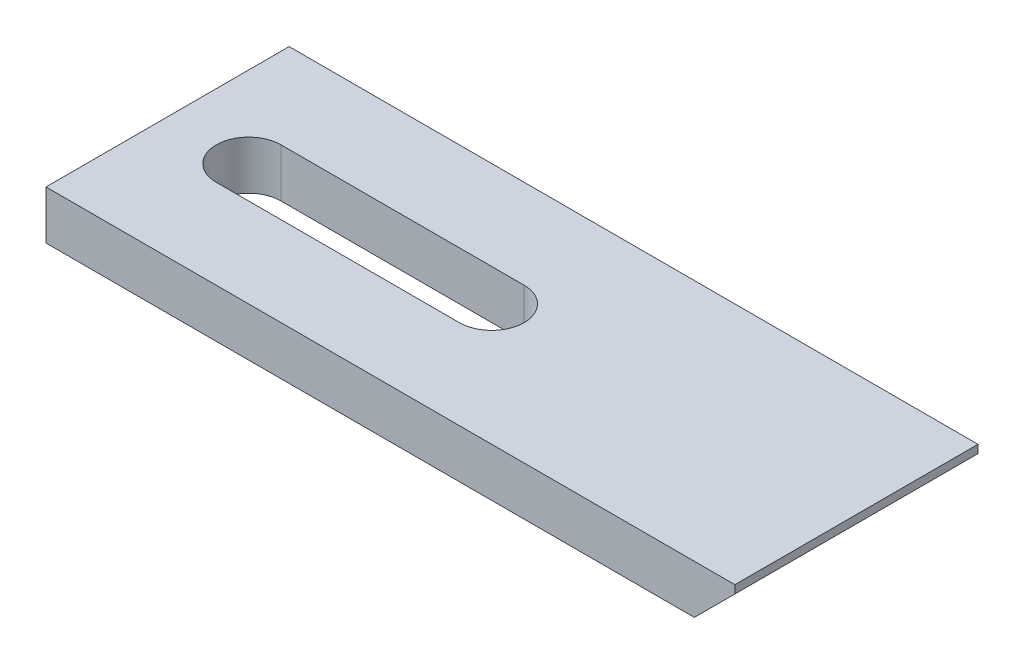
ISO-10303-21;
HEADER;
FILE_DESCRIPTION(('STEP AP214'),'2;1');
FILE_NAME('part.step','',(''),(''),'','','');
FILE_SCHEMA(('AUTOMOTIVE_DESIGN { 1 0 10303 214 1 1 1 1 }'));
ENDSEC;
DATA;
#1=APPLICATION_CONTEXT('core data for automotive mechanical design processes');
#2=APPLICATION_PROTOCOL_DEFINITION('international standard','automotive_design',2000,#1);
#3=PRODUCT_CONTEXT('',#1,'mechanical');
#4=PRODUCT('Part','Part','',(#3));
#5=PRODUCT_RELATED_PRODUCT_CATEGORY('part','',(#4));
#6=PRODUCT_DEFINITION_FORMATION('','',#4);
#7=PRODUCT_DEFINITION_CONTEXT('part definition',#1,'design');
#8=PRODUCT_DEFINITION('design','',#6,#7);
#9=PRODUCT_DEFINITION_SHAPE('','',#8);
#10=(LENGTH_UNIT() NAMED_UNIT(*) SI_UNIT(.MILLI.,.METRE.));
#11=(NAMED_UNIT(*) PLANE_ANGLE_UNIT() SI_UNIT($,.RADIAN.));
#12=(NAMED_UNIT(*) SI_UNIT($,.STERADIAN.) SOLID_ANGLE_UNIT());
#13=UNCERTAINTY_MEASURE_WITH_UNIT(LENGTH_MEASURE(1.E-05),#10,'distance_accuracy_value','');
#14=(GEOMETRIC_REPRESENTATION_CONTEXT(3) GLOBAL_UNCERTAINTY_ASSIGNED_CONTEXT((#13)) GLOBAL_UNIT_ASSIGNED_CONTEXT((#10,
#11,#12)) REPRESENTATION_CONTEXT('',''));
#15=CARTESIAN_POINT('',(0.,0.,0.));
#16=DIRECTION('',(0.,0.,1.));
#17=DIRECTION('',(1.,0.,0.));
#18=AXIS2_PLACEMENT_3D('',#15,#16,#17);
#19=CARTESIAN_POINT('',(-42.5,6.,15.));
#20=DIRECTION('',(0.,1.,0.));
#21=DIRECTION('',(0.,0.,1.));
#22=AXIS2_PLACEMENT_3D('',#19,#20,#21);
#23=PLANE('',#22);
#24=DIRECTION('',(-1.,0.,0.));
#25=VECTOR('',#24,1.);
#26=CARTESIAN_POINT('',(-32.5,6.,-3.99999999999999));
#27=LINE('',#26,#25);
#28=CARTESIAN_POINT('',(-2.5,6.,-3.99999999999999));
#29=VERTEX_POINT('',#28);
#30=CARTESIAN_POINT('',(-32.5,6.,-3.99999999999999));
#31=VERTEX_POINT('',#30);
#32=EDGE_CURVE('E151',#29,#31,#27,.T.);
#33=ORIENTED_EDGE('',*,*,#32,.F.);
#34=CARTESIAN_POINT('',(-2.5,6.,0.));
#35=DIRECTION('',(0.,1.,0.));
#36=DIRECTION('',(0.,0.,-1.));
#37=AXIS2_PLACEMENT_3D('',#34,#35,#36);
#38=CIRCLE('',#37,4.);
#39=CARTESIAN_POINT('',(-2.5,6.,4.00000000000001));
#40=VERTEX_POINT('',#39);
#41=EDGE_CURVE('E169',#40,#29,#38,.T.);
#42=ORIENTED_EDGE('',*,*,#41,.F.);
#43=DIRECTION('',(1.,0.,0.));
#44=VECTOR('',#43,1.);
#45=CARTESIAN_POINT('',(-32.5,6.,4.00000000000001));
#46=LINE('',#45,#44);
#47=CARTESIAN_POINT('',(-32.5,6.,4.00000000000001));
#48=VERTEX_POINT('',#47);
#49=EDGE_CURVE('E161',#48,#40,#46,.T.);
#50=ORIENTED_EDGE('',*,*,#49,.F.);
#51=CARTESIAN_POINT('',(-32.5,6.,0.));
#52=DIRECTION('',(0.,1.,0.));
#53=DIRECTION('',(0.,0.,1.));
#54=AXIS2_PLACEMENT_3D('',#51,#52,#53);
#55=CIRCLE('',#54,4.);
#56=EDGE_CURVE('E155',#31,#48,#55,.T.);
#57=ORIENTED_EDGE('',*,*,#56,.F.);
#58=EDGE_LOOP('',(#33,#42,#50,#57));
#59=FACE_BOUND('',#58,.T.);
#60=DIRECTION('',(0.,0.,1.));
#61=VECTOR('',#60,1.);
#62=CARTESIAN_POINT('',(-42.5,6.,-15.));
#63=LINE('',#62,#61);
#64=CARTESIAN_POINT('',(-42.5,6.,-15.));
#65=VERTEX_POINT('',#64);
#66=CARTESIAN_POINT('',(-42.5,6.,15.));
#67=VERTEX_POINT('',#66);
#68=EDGE_CURVE('E131',#65,#67,#63,.T.);
#69=ORIENTED_EDGE('',*,*,#68,.T.);
#70=DIRECTION('',(1.,0.,0.));
#71=VECTOR('',#70,1.);
#72=CARTESIAN_POINT('',(-42.5,6.,15.));
#73=LINE('',#72,#71);
#74=CARTESIAN_POINT('',(42.5,6.,15.));
#75=VERTEX_POINT('',#74);
#76=EDGE_CURVE('E142',#67,#75,#73,.T.);
#77=ORIENTED_EDGE('',*,*,#76,.T.);
#78=DIRECTION('',(0.,0.,-1.));
#79=VECTOR('',#78,1.);
#80=CARTESIAN_POINT('',(42.5,6.,-15.));
#81=LINE('',#80,#79);
#82=CARTESIAN_POINT('',(42.5,6.,-15.));
#83=VERTEX_POINT('',#82);
#84=EDGE_CURVE('E140',#75,#83,#81,.T.);
#85=ORIENTED_EDGE('',*,*,#84,.T.);
#86=DIRECTION('',(-1.,0.,0.));
#87=VECTOR('',#86,1.);
#88=CARTESIAN_POINT('',(-42.5,6.,-15.));
#89=LINE('',#88,#87);
#90=EDGE_CURVE('E123',#83,#65,#89,.T.);
#91=ORIENTED_EDGE('',*,*,#90,.T.);
#92=EDGE_LOOP('',(#69,#77,#85,#91));
#93=FACE_BOUND('',#92,.T.);
#94=ADVANCED_FACE('F33',(#59,#93),#23,.T.);
#95=CARTESIAN_POINT('',(-42.5,0.,15.));
#96=DIRECTION('',(0.,1.,0.));
#97=DIRECTION('',(0.,0.,1.));
#98=AXIS2_PLACEMENT_3D('',#95,#96,#97);
#99=PLANE('',#98);
#100=CARTESIAN_POINT('',(-2.5,0.,0.));
#101=DIRECTION('',(0.,1.,0.));
#102=DIRECTION('',(0.,0.,-1.));
#103=AXIS2_PLACEMENT_3D('',#100,#101,#102);
#104=CIRCLE('',#103,4.);
#105=CARTESIAN_POINT('',(-2.5,0.,4.00000000000001));
#106=VERTEX_POINT('',#105);
#107=CARTESIAN_POINT('',(-2.5,0.,-3.99999999999999));
#108=VERTEX_POINT('',#107);
#109=EDGE_CURVE('E170',#106,#108,#104,.T.);
#110=ORIENTED_EDGE('',*,*,#109,.T.);
#111=DIRECTION('',(-1.,0.,0.));
#112=VECTOR('',#111,1.);
#113=CARTESIAN_POINT('',(-32.5,0.,-3.99999999999999));
#114=LINE('',#113,#112);
#115=CARTESIAN_POINT('',(-32.5,0.,-3.99999999999999));
#116=VERTEX_POINT('',#115);
#117=EDGE_CURVE('E152',#108,#116,#114,.T.);
#118=ORIENTED_EDGE('',*,*,#117,.T.);
#119=CARTESIAN_POINT('',(-32.5,0.,0.));
#120=DIRECTION('',(0.,1.,0.));
#121=DIRECTION('',(0.,0.,1.));
#122=AXIS2_PLACEMENT_3D('',#119,#120,#121);
#123=CIRCLE('',#122,4.);
#124=CARTESIAN_POINT('',(-32.5,0.,4.00000000000001));
#125=VERTEX_POINT('',#124);
#126=EDGE_CURVE('E157',#116,#125,#123,.T.);
#127=ORIENTED_EDGE('',*,*,#126,.T.);
#128=DIRECTION('',(1.,0.,0.));
#129=VECTOR('',#128,1.);
#130=CARTESIAN_POINT('',(-32.5,0.,4.00000000000001));
#131=LINE('',#130,#129);
#132=EDGE_CURVE('E56',#125,#106,#131,.T.);
#133=ORIENTED_EDGE('',*,*,#132,.T.);
#134=EDGE_LOOP('',(#110,#118,#127,#133));
#135=FACE_BOUND('',#134,.T.);
#136=DIRECTION('',(-1.,0.,0.));
#137=VECTOR('',#136,1.);
#138=CARTESIAN_POINT('',(-42.5,0.,-15.));
#139=LINE('',#138,#137);
#140=CARTESIAN_POINT('',(37.5,0.,-15.));
#141=VERTEX_POINT('',#140);
#142=CARTESIAN_POINT('',(-42.5,0.,-15.));
#143=VERTEX_POINT('',#142);
#144=EDGE_CURVE('E129',#141,#143,#139,.T.);
#145=ORIENTED_EDGE('',*,*,#144,.F.);
#146=DIRECTION('',(0.,0.,1.));
#147=VECTOR('',#146,1.);
#148=CARTESIAN_POINT('',(37.5,0.,-15.));
#149=LINE('',#148,#147);
#150=CARTESIAN_POINT('',(37.5,0.,15.));
#151=VERTEX_POINT('',#150);
#152=EDGE_CURVE('E48',#141,#151,#149,.T.);
#153=ORIENTED_EDGE('',*,*,#152,.T.);
#154=DIRECTION('',(1.,0.,0.));
#155=VECTOR('',#154,1.);
#156=CARTESIAN_POINT('',(-42.5,0.,15.));
#157=LINE('',#156,#155);
#158=CARTESIAN_POINT('',(-42.5,0.,15.));
#159=VERTEX_POINT('',#158);
#160=EDGE_CURVE('E132',#159,#151,#157,.T.);
#161=ORIENTED_EDGE('',*,*,#160,.F.);
#162=DIRECTION('',(0.,0.,1.));
#163=VECTOR('',#162,1.);
#164=CARTESIAN_POINT('',(-42.5,0.,-15.));
#165=LINE('',#164,#163);
#166=EDGE_CURVE('E135',#143,#159,#165,.T.);
#167=ORIENTED_EDGE('',*,*,#166,.F.);
#168=EDGE_LOOP('',(#145,#153,#161,#167));
#169=FACE_BOUND('',#168,.T.);
#170=ADVANCED_FACE('F177',(#135,#169),#99,.F.);
#171=CARTESIAN_POINT('',(-42.5,6.,-15.));
#172=DIRECTION('',(1.,0.,0.));
#173=DIRECTION('',(0.,0.,-1.));
#174=AXIS2_PLACEMENT_3D('',#171,#172,#173);
#175=PLANE('',#174);
#176=ORIENTED_EDGE('',*,*,#166,.T.);
#177=DIRECTION('',(0.,-1.,0.));
#178=VECTOR('',#177,1.);
#179=CARTESIAN_POINT('',(-42.5,6.,15.));
#180=LINE('',#179,#178);
#181=EDGE_CURVE('E11',#67,#159,#180,.T.);
#182=ORIENTED_EDGE('',*,*,#181,.F.);
#183=ORIENTED_EDGE('',*,*,#68,.F.);
#184=DIRECTION('',(0.,-1.,0.));
#185=VECTOR('',#184,1.);
#186=CARTESIAN_POINT('',(-42.5,6.,-15.));
#187=LINE('',#186,#185);
#188=EDGE_CURVE('E124',#65,#143,#187,.T.);
#189=ORIENTED_EDGE('',*,*,#188,.T.);
#190=EDGE_LOOP('',(#176,#182,#183,#189));
#191=FACE_BOUND('',#190,.T.);
#192=ADVANCED_FACE('F35',(#191),#175,.F.);
#193=CARTESIAN_POINT('',(-42.5,6.,15.));
#194=DIRECTION('',(0.,0.,-1.));
#195=DIRECTION('',(-1.,0.,0.));
#196=AXIS2_PLACEMENT_3D('',#193,#194,#195);
#197=PLANE('',#196);
#198=ORIENTED_EDGE('',*,*,#160,.T.);
#199=DIRECTION('',(-0.707106781186547,-0.707106781186548,0.));
#200=VECTOR('',#199,1.);
#201=CARTESIAN_POINT('',(42.5,5.,15.));
#202=LINE('',#201,#200);
#203=CARTESIAN_POINT('',(42.5,5.,15.));
#204=VERTEX_POINT('',#203);
#205=EDGE_CURVE('E110',#204,#151,#202,.T.);
#206=ORIENTED_EDGE('',*,*,#205,.F.);
#207=DIRECTION('',(0.,-1.,0.));
#208=VECTOR('',#207,1.);
#209=CARTESIAN_POINT('',(42.5,6.,15.));
#210=LINE('',#209,#208);
#211=EDGE_CURVE('E41',#75,#204,#210,.T.);
#212=ORIENTED_EDGE('',*,*,#211,.F.);
#213=ORIENTED_EDGE('',*,*,#76,.F.);
#214=ORIENTED_EDGE('',*,*,#181,.T.);
#215=EDGE_LOOP('',(#198,#206,#212,#213,#214));
#216=FACE_BOUND('',#215,.T.);
#217=ADVANCED_FACE('F179',(#216),#197,.F.);
#218=CARTESIAN_POINT('',(42.5,6.,-15.));
#219=DIRECTION('',(-1.,0.,0.));
#220=DIRECTION('',(0.,0.,1.));
#221=AXIS2_PLACEMENT_3D('',#218,#219,#220);
#222=PLANE('',#221);
#223=ORIENTED_EDGE('',*,*,#211,.T.);
#224=DIRECTION('',(0.,0.,1.));
#225=VECTOR('',#224,1.);
#226=CARTESIAN_POINT('',(42.5,5.,-15.));
#227=LINE('',#226,#225);
#228=CARTESIAN_POINT('',(42.5,5.,-15.));
#229=VERTEX_POINT('',#228);
#230=EDGE_CURVE('E105',#229,#204,#227,.T.);
#231=ORIENTED_EDGE('',*,*,#230,.F.);
#232=DIRECTION('',(0.,-1.,0.));
#233=VECTOR('',#232,1.);
#234=CARTESIAN_POINT('',(42.5,6.,-15.));
#235=LINE('',#234,#233);
#236=EDGE_CURVE('E117',#83,#229,#235,.T.);
#237=ORIENTED_EDGE('',*,*,#236,.F.);
#238=ORIENTED_EDGE('',*,*,#84,.F.);
#239=EDGE_LOOP('',(#223,#231,#237,#238));
#240=FACE_BOUND('',#239,.T.);
#241=ADVANCED_FACE('F115',(#240),#222,.F.);
#242=CARTESIAN_POINT('',(-42.5,6.,-15.));
#243=DIRECTION('',(0.,0.,1.));
#244=DIRECTION('',(1.,0.,0.));
#245=AXIS2_PLACEMENT_3D('',#242,#243,#244);
#246=PLANE('',#245);
#247=ORIENTED_EDGE('',*,*,#236,.T.);
#248=DIRECTION('',(-0.707106781186547,-0.707106781186548,0.));
#249=VECTOR('',#248,1.);
#250=CARTESIAN_POINT('',(42.5,5.,-15.));
#251=LINE('',#250,#249);
#252=EDGE_CURVE('E102',#229,#141,#251,.T.);
#253=ORIENTED_EDGE('',*,*,#252,.T.);
#254=ORIENTED_EDGE('',*,*,#144,.T.);
#255=ORIENTED_EDGE('',*,*,#188,.F.);
#256=ORIENTED_EDGE('',*,*,#90,.F.);
#257=EDGE_LOOP('',(#247,#253,#254,#255,#256));
#258=FACE_BOUND('',#257,.T.);
#259=ADVANCED_FACE('F121',(#258),#246,.F.);
#260=CARTESIAN_POINT('',(-32.5,6.,0.));
#261=DIRECTION('',(0.,-1.,0.));
#262=DIRECTION('',(0.,0.,-1.));
#263=AXIS2_PLACEMENT_3D('',#260,#261,#262);
#264=CYLINDRICAL_SURFACE('',#263,4.);
#265=ORIENTED_EDGE('',*,*,#126,.F.);
#266=DIRECTION('',(0.,-1.,0.));
#267=VECTOR('',#266,1.);
#268=CARTESIAN_POINT('',(-32.5,6.,-3.99999999999999));
#269=LINE('',#268,#267);
#270=EDGE_CURVE('E148',#31,#116,#269,.T.);
#271=ORIENTED_EDGE('',*,*,#270,.F.);
#272=ORIENTED_EDGE('',*,*,#56,.T.);
#273=DIRECTION('',(0.,-1.,0.));
#274=VECTOR('',#273,1.);
#275=CARTESIAN_POINT('',(-32.5,6.,4.00000000000001));
#276=LINE('',#275,#274);
#277=EDGE_CURVE('E138',#48,#125,#276,.T.);
#278=ORIENTED_EDGE('',*,*,#277,.T.);
#279=EDGE_LOOP('',(#265,#271,#272,#278));
#280=FACE_BOUND('',#279,.T.);
#281=ADVANCED_FACE('F192',(#280),#264,.F.);
#282=CARTESIAN_POINT('',(-32.5,6.,4.00000000000001));
#283=DIRECTION('',(0.,0.,-1.));
#284=DIRECTION('',(-1.,0.,0.));
#285=AXIS2_PLACEMENT_3D('',#282,#283,#284);
#286=PLANE('',#285);
#287=ORIENTED_EDGE('',*,*,#132,.F.);
#288=ORIENTED_EDGE('',*,*,#277,.F.);
#289=ORIENTED_EDGE('',*,*,#49,.T.);
#290=DIRECTION('',(0.,-1.,0.));
#291=VECTOR('',#290,1.);
#292=CARTESIAN_POINT('',(-2.5,6.,4.00000000000001));
#293=LINE('',#292,#291);
#294=EDGE_CURVE('E166',#40,#106,#293,.T.);
#295=ORIENTED_EDGE('',*,*,#294,.T.);
#296=EDGE_LOOP('',(#287,#288,#289,#295));
#297=FACE_BOUND('',#296,.T.);
#298=ADVANCED_FACE('F217',(#297),#286,.T.);
#299=CARTESIAN_POINT('',(-32.5,6.,-3.99999999999999));
#300=DIRECTION('',(0.,0.,1.));
#301=DIRECTION('',(1.,0.,0.));
#302=AXIS2_PLACEMENT_3D('',#299,#300,#301);
#303=PLANE('',#302);
#304=ORIENTED_EDGE('',*,*,#117,.F.);
#305=DIRECTION('',(0.,-1.,0.));
#306=VECTOR('',#305,1.);
#307=CARTESIAN_POINT('',(-2.5,6.,-3.99999999999999));
#308=LINE('',#307,#306);
#309=EDGE_CURVE('E159',#29,#108,#308,.T.);
#310=ORIENTED_EDGE('',*,*,#309,.F.);
#311=ORIENTED_EDGE('',*,*,#32,.T.);
#312=ORIENTED_EDGE('',*,*,#270,.T.);
#313=EDGE_LOOP('',(#304,#310,#311,#312));
#314=FACE_BOUND('',#313,.T.);
#315=ADVANCED_FACE('F222',(#314),#303,.T.);
#316=CARTESIAN_POINT('',(-2.5,6.,0.));
#317=DIRECTION('',(0.,-1.,0.));
#318=DIRECTION('',(0.,0.,-1.));
#319=AXIS2_PLACEMENT_3D('',#316,#317,#318);
#320=CYLINDRICAL_SURFACE('',#319,4.);
#321=ORIENTED_EDGE('',*,*,#109,.F.);
#322=ORIENTED_EDGE('',*,*,#294,.F.);
#323=ORIENTED_EDGE('',*,*,#41,.T.);
#324=ORIENTED_EDGE('',*,*,#309,.T.);
#325=EDGE_LOOP('',(#321,#322,#323,#324));
#326=FACE_BOUND('',#325,.T.);
#327=ADVANCED_FACE('F232',(#326),#320,.F.);
#328=CARTESIAN_POINT('',(42.5,5.,-15.));
#329=DIRECTION('',(-0.707106781186548,0.707106781186547,0.));
#330=DIRECTION('',(-0.707106781186547,-0.707106781186548,0.));
#331=AXIS2_PLACEMENT_3D('',#328,#329,#330);
#332=PLANE('',#331);
#333=ORIENTED_EDGE('',*,*,#205,.T.);
#334=ORIENTED_EDGE('',*,*,#152,.F.);
#335=ORIENTED_EDGE('',*,*,#252,.F.);
#336=ORIENTED_EDGE('',*,*,#230,.T.);
#337=EDGE_LOOP('',(#333,#334,#335,#336));
#338=FACE_BOUND('',#337,.T.);
#339=ADVANCED_FACE('F104',(#338),#332,.F.);
#340=CLOSED_SHELL('',(#94,#170,#192,#217,#241,#259,#281,#298,#315,#327,#339));
#341=MANIFOLD_SOLID_BREP('B2',#340);
#342=ADVANCED_BREP_SHAPE_REPRESENTATION('',(#18,#341),#14);
#343=SHAPE_DEFINITION_REPRESENTATION(#9,#342);
ENDSEC;
END-ISO-10303-21;
